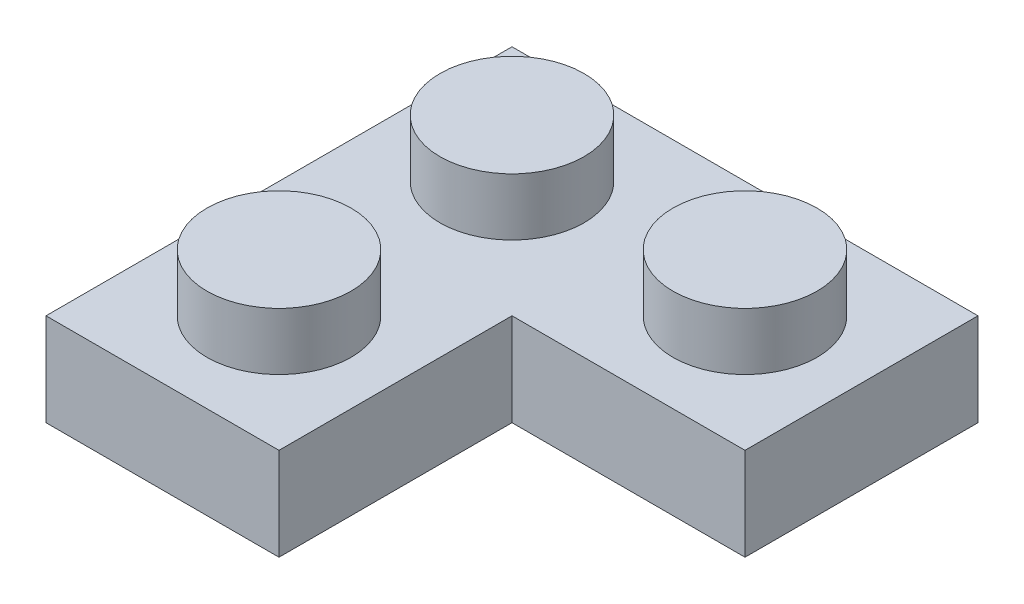
ISO-10303-21;
HEADER;
FILE_DESCRIPTION(('STEP AP214'),'2;1');
FILE_NAME('part.step','',(''),(''),'','','');
FILE_SCHEMA(('AUTOMOTIVE_DESIGN { 1 0 10303 214 1 1 1 1 }'));
ENDSEC;
DATA;
#1=APPLICATION_CONTEXT('core data for automotive mechanical design processes');
#2=APPLICATION_PROTOCOL_DEFINITION('international standard','automotive_design',2000,#1);
#3=PRODUCT_CONTEXT('',#1,'mechanical');
#4=PRODUCT('Part','Part','',(#3));
#5=PRODUCT_RELATED_PRODUCT_CATEGORY('part','',(#4));
#6=PRODUCT_DEFINITION_FORMATION('','',#4);
#7=PRODUCT_DEFINITION_CONTEXT('part definition',#1,'design');
#8=PRODUCT_DEFINITION('design','',#6,#7);
#9=PRODUCT_DEFINITION_SHAPE('','',#8);
#10=(LENGTH_UNIT() NAMED_UNIT(*) SI_UNIT(.MILLI.,.METRE.));
#11=(NAMED_UNIT(*) PLANE_ANGLE_UNIT() SI_UNIT($,.RADIAN.));
#12=(NAMED_UNIT(*) SI_UNIT($,.STERADIAN.) SOLID_ANGLE_UNIT());
#13=UNCERTAINTY_MEASURE_WITH_UNIT(LENGTH_MEASURE(1.E-05),#10,'distance_accuracy_value','');
#14=(GEOMETRIC_REPRESENTATION_CONTEXT(3) GLOBAL_UNCERTAINTY_ASSIGNED_CONTEXT((#13)) GLOBAL_UNIT_ASSIGNED_CONTEXT((#10,
#11,#12)) REPRESENTATION_CONTEXT('',''));
#15=CARTESIAN_POINT('',(0.,0.,0.));
#16=DIRECTION('',(0.,0.,1.));
#17=DIRECTION('',(1.,0.,0.));
#18=AXIS2_PLACEMENT_3D('',#15,#16,#17);
#19=CARTESIAN_POINT('',(7.925,-3.15,0.));
#20=DIRECTION('',(0.,0.,1.));
#21=DIRECTION('',(1.,0.,0.));
#22=AXIS2_PLACEMENT_3D('',#19,#20,#21);
#23=PLANE('',#22);
#24=DIRECTION('',(1.,0.,0.));
#25=VECTOR('',#24,1.);
#26=CARTESIAN_POINT('',(7.925,0.,0.));
#27=LINE('',#26,#25);
#28=CARTESIAN_POINT('',(0.,0.,0.));
#29=VERTEX_POINT('',#28);
#30=CARTESIAN_POINT('',(7.925,0.,0.));
#31=VERTEX_POINT('',#30);
#32=EDGE_CURVE('E131',#29,#31,#27,.T.);
#33=ORIENTED_EDGE('',*,*,#32,.F.);
#34=DIRECTION('',(0.,1.,0.));
#35=VECTOR('',#34,1.);
#36=CARTESIAN_POINT('',(0.,-3.15,0.));
#37=LINE('',#36,#35);
#38=CARTESIAN_POINT('',(0.,-3.15,0.));
#39=VERTEX_POINT('',#38);
#40=EDGE_CURVE('E11',#39,#29,#37,.T.);
#41=ORIENTED_EDGE('',*,*,#40,.F.);
#42=DIRECTION('',(1.,0.,0.));
#43=VECTOR('',#42,1.);
#44=CARTESIAN_POINT('',(7.925,-3.15,0.));
#45=LINE('',#44,#43);
#46=CARTESIAN_POINT('',(7.925,-3.15,0.));
#47=VERTEX_POINT('',#46);
#48=EDGE_CURVE('E146',#39,#47,#45,.T.);
#49=ORIENTED_EDGE('',*,*,#48,.T.);
#50=DIRECTION('',(0.,1.,0.));
#51=VECTOR('',#50,1.);
#52=CARTESIAN_POINT('',(7.925,-3.15,0.));
#53=LINE('',#52,#51);
#54=EDGE_CURVE('E36',#47,#31,#53,.T.);
#55=ORIENTED_EDGE('',*,*,#54,.T.);
#56=EDGE_LOOP('',(#33,#41,#49,#55));
#57=FACE_BOUND('',#56,.T.);
#58=ADVANCED_FACE('F33',(#57),#23,.T.);
#59=CARTESIAN_POINT('',(0.,-3.15,0.));
#60=DIRECTION('',(1.,0.,0.));
#61=DIRECTION('',(0.,0.,-1.));
#62=AXIS2_PLACEMENT_3D('',#59,#60,#61);
#63=PLANE('',#62);
#64=DIRECTION('',(0.,0.,-1.));
#65=VECTOR('',#64,1.);
#66=CARTESIAN_POINT('',(0.,0.,0.));
#67=LINE('',#66,#65);
#68=CARTESIAN_POINT('',(0.,0.,7.925));
#69=VERTEX_POINT('',#68);
#70=EDGE_CURVE('E144',#69,#29,#67,.T.);
#71=ORIENTED_EDGE('',*,*,#70,.F.);
#72=DIRECTION('',(0.,1.,0.));
#73=VECTOR('',#72,1.);
#74=CARTESIAN_POINT('',(0.,-3.15,7.925));
#75=LINE('',#74,#73);
#76=CARTESIAN_POINT('',(0.,-3.15,7.925));
#77=VERTEX_POINT('',#76);
#78=EDGE_CURVE('E41',#77,#69,#75,.T.);
#79=ORIENTED_EDGE('',*,*,#78,.F.);
#80=DIRECTION('',(0.,0.,-1.));
#81=VECTOR('',#80,1.);
#82=CARTESIAN_POINT('',(0.,-3.15,0.));
#83=LINE('',#82,#81);
#84=EDGE_CURVE('E121',#77,#39,#83,.T.);
#85=ORIENTED_EDGE('',*,*,#84,.T.);
#86=ORIENTED_EDGE('',*,*,#40,.T.);
#87=EDGE_LOOP('',(#71,#79,#85,#86));
#88=FACE_BOUND('',#87,.T.);
#89=ADVANCED_FACE('F154',(#88),#63,.T.);
#90=CARTESIAN_POINT('',(0.,-3.15,7.925));
#91=DIRECTION('',(0.,0.,1.));
#92=DIRECTION('',(1.,0.,0.));
#93=AXIS2_PLACEMENT_3D('',#90,#91,#92);
#94=PLANE('',#93);
#95=DIRECTION('',(1.,0.,0.));
#96=VECTOR('',#95,1.);
#97=CARTESIAN_POINT('',(0.,0.,7.925));
#98=LINE('',#97,#96);
#99=CARTESIAN_POINT('',(-7.925,0.,7.925));
#100=VERTEX_POINT('',#99);
#101=EDGE_CURVE('E108',#100,#69,#98,.T.);
#102=ORIENTED_EDGE('',*,*,#101,.F.);
#103=DIRECTION('',(0.,1.,0.));
#104=VECTOR('',#103,1.);
#105=CARTESIAN_POINT('',(-7.925,-3.15,7.925));
#106=LINE('',#105,#104);
#107=CARTESIAN_POINT('',(-7.925,-3.15,7.925));
#108=VERTEX_POINT('',#107);
#109=EDGE_CURVE('E102',#108,#100,#106,.T.);
#110=ORIENTED_EDGE('',*,*,#109,.F.);
#111=DIRECTION('',(1.,0.,0.));
#112=VECTOR('',#111,1.);
#113=CARTESIAN_POINT('',(0.,-3.15,7.925));
#114=LINE('',#113,#112);
#115=EDGE_CURVE('E105',#108,#77,#114,.T.);
#116=ORIENTED_EDGE('',*,*,#115,.T.);
#117=ORIENTED_EDGE('',*,*,#78,.T.);
#118=EDGE_LOOP('',(#102,#110,#116,#117));
#119=FACE_BOUND('',#118,.T.);
#120=ADVANCED_FACE('F104',(#119),#94,.T.);
#121=CARTESIAN_POINT('',(-7.925,-3.15,7.925));
#122=DIRECTION('',(-1.,0.,0.));
#123=DIRECTION('',(0.,0.,1.));
#124=AXIS2_PLACEMENT_3D('',#121,#122,#123);
#125=PLANE('',#124);
#126=DIRECTION('',(0.,0.,1.));
#127=VECTOR('',#126,1.);
#128=CARTESIAN_POINT('',(-7.925,0.,7.925));
#129=LINE('',#128,#127);
#130=CARTESIAN_POINT('',(-7.925,0.,-7.925));
#131=VERTEX_POINT('',#130);
#132=EDGE_CURVE('E141',#131,#100,#129,.T.);
#133=ORIENTED_EDGE('',*,*,#132,.F.);
#134=DIRECTION('',(0.,1.,0.));
#135=VECTOR('',#134,1.);
#136=CARTESIAN_POINT('',(-7.925,-3.15,-7.925));
#137=LINE('',#136,#135);
#138=CARTESIAN_POINT('',(-7.925,-3.15,-7.925));
#139=VERTEX_POINT('',#138);
#140=EDGE_CURVE('E113',#139,#131,#137,.T.);
#141=ORIENTED_EDGE('',*,*,#140,.F.);
#142=DIRECTION('',(0.,0.,1.));
#143=VECTOR('',#142,1.);
#144=CARTESIAN_POINT('',(-7.925,-3.15,7.925));
#145=LINE('',#144,#143);
#146=EDGE_CURVE('E119',#139,#108,#145,.T.);
#147=ORIENTED_EDGE('',*,*,#146,.T.);
#148=ORIENTED_EDGE('',*,*,#109,.T.);
#149=EDGE_LOOP('',(#133,#141,#147,#148));
#150=FACE_BOUND('',#149,.T.);
#151=ADVANCED_FACE('F123',(#150),#125,.T.);
#152=CARTESIAN_POINT('',(-7.925,-3.15,-7.925));
#153=DIRECTION('',(0.,0.,-1.));
#154=DIRECTION('',(-1.,0.,0.));
#155=AXIS2_PLACEMENT_3D('',#152,#153,#154);
#156=PLANE('',#155);
#157=DIRECTION('',(-1.,0.,0.));
#158=VECTOR('',#157,1.);
#159=CARTESIAN_POINT('',(-7.925,0.,-7.925));
#160=LINE('',#159,#158);
#161=CARTESIAN_POINT('',(7.925,0.,-7.925));
#162=VERTEX_POINT('',#161);
#163=EDGE_CURVE('E138',#162,#131,#160,.T.);
#164=ORIENTED_EDGE('',*,*,#163,.F.);
#165=DIRECTION('',(0.,1.,0.));
#166=VECTOR('',#165,1.);
#167=CARTESIAN_POINT('',(7.925,-3.15,-7.925));
#168=LINE('',#167,#166);
#169=CARTESIAN_POINT('',(7.925,-3.15,-7.925));
#170=VERTEX_POINT('',#169);
#171=EDGE_CURVE('E149',#170,#162,#168,.T.);
#172=ORIENTED_EDGE('',*,*,#171,.F.);
#173=DIRECTION('',(-1.,0.,0.));
#174=VECTOR('',#173,1.);
#175=CARTESIAN_POINT('',(-7.925,-3.15,-7.925));
#176=LINE('',#175,#174);
#177=EDGE_CURVE('E124',#170,#139,#176,.T.);
#178=ORIENTED_EDGE('',*,*,#177,.T.);
#179=ORIENTED_EDGE('',*,*,#140,.T.);
#180=EDGE_LOOP('',(#164,#172,#178,#179));
#181=FACE_BOUND('',#180,.T.);
#182=ADVANCED_FACE('F167',(#181),#156,.T.);
#183=CARTESIAN_POINT('',(7.925,-3.15,-7.925));
#184=DIRECTION('',(1.,0.,0.));
#185=DIRECTION('',(0.,0.,-1.));
#186=AXIS2_PLACEMENT_3D('',#183,#184,#185);
#187=PLANE('',#186);
#188=DIRECTION('',(0.,0.,-1.));
#189=VECTOR('',#188,1.);
#190=CARTESIAN_POINT('',(7.925,0.,-7.925));
#191=LINE('',#190,#189);
#192=EDGE_CURVE('E134',#31,#162,#191,.T.);
#193=ORIENTED_EDGE('',*,*,#192,.F.);
#194=ORIENTED_EDGE('',*,*,#54,.F.);
#195=DIRECTION('',(0.,0.,-1.));
#196=VECTOR('',#195,1.);
#197=CARTESIAN_POINT('',(7.925,-3.15,-7.925));
#198=LINE('',#197,#196);
#199=EDGE_CURVE('E126',#47,#170,#198,.T.);
#200=ORIENTED_EDGE('',*,*,#199,.T.);
#201=ORIENTED_EDGE('',*,*,#171,.T.);
#202=EDGE_LOOP('',(#193,#194,#200,#201));
#203=FACE_BOUND('',#202,.T.);
#204=ADVANCED_FACE('F151',(#203),#187,.T.);
#205=CARTESIAN_POINT('',(0.,-3.15,0.));
#206=DIRECTION('',(0.,1.,0.));
#207=DIRECTION('',(0.,0.,1.));
#208=AXIS2_PLACEMENT_3D('',#205,#206,#207);
#209=PLANE('',#208);
#210=DIRECTION('',(0.,0.,-1.));
#211=VECTOR('',#210,1.);
#212=CARTESIAN_POINT('',(-1.5,-3.15,0.));
#213=LINE('',#212,#211);
#214=CARTESIAN_POINT('',(-1.5,-3.15,6.425));
#215=VERTEX_POINT('',#214);
#216=CARTESIAN_POINT('',(-1.5,-3.15,-1.5));
#217=VERTEX_POINT('',#216);
#218=EDGE_CURVE('E291',#215,#217,#213,.T.);
#219=ORIENTED_EDGE('',*,*,#218,.T.);
#220=DIRECTION('',(1.,0.,0.));
#221=VECTOR('',#220,1.);
#222=CARTESIAN_POINT('',(0.,-3.15,-1.5));
#223=LINE('',#222,#221);
#224=CARTESIAN_POINT('',(6.425,-3.15,-1.5));
#225=VERTEX_POINT('',#224);
#226=EDGE_CURVE('E294',#217,#225,#223,.T.);
#227=ORIENTED_EDGE('',*,*,#226,.T.);
#228=DIRECTION('',(0.,0.,-1.));
#229=VECTOR('',#228,1.);
#230=CARTESIAN_POINT('',(6.425,-3.15,0.));
#231=LINE('',#230,#229);
#232=CARTESIAN_POINT('',(6.425,-3.15,-6.425));
#233=VERTEX_POINT('',#232);
#234=EDGE_CURVE('E328',#225,#233,#231,.T.);
#235=ORIENTED_EDGE('',*,*,#234,.T.);
#236=DIRECTION('',(-1.,0.,0.));
#237=VECTOR('',#236,1.);
#238=CARTESIAN_POINT('',(0.,-3.15,-6.425));
#239=LINE('',#238,#237);
#240=CARTESIAN_POINT('',(-6.425,-3.15,-6.425));
#241=VERTEX_POINT('',#240);
#242=EDGE_CURVE('E49',#233,#241,#239,.T.);
#243=ORIENTED_EDGE('',*,*,#242,.T.);
#244=DIRECTION('',(0.,0.,1.));
#245=VECTOR('',#244,1.);
#246=CARTESIAN_POINT('',(-6.425,-3.15,0.));
#247=LINE('',#246,#245);
#248=CARTESIAN_POINT('',(-6.425,-3.15,6.425));
#249=VERTEX_POINT('',#248);
#250=EDGE_CURVE('E333',#241,#249,#247,.T.);
#251=ORIENTED_EDGE('',*,*,#250,.T.);
#252=DIRECTION('',(1.,0.,0.));
#253=VECTOR('',#252,1.);
#254=CARTESIAN_POINT('',(0.,-3.15,6.425));
#255=LINE('',#254,#253);
#256=EDGE_CURVE('E330',#249,#215,#255,.T.);
#257=ORIENTED_EDGE('',*,*,#256,.T.);
#258=EDGE_LOOP('',(#219,#227,#235,#243,#251,#257));
#259=FACE_BOUND('',#258,.T.);
#260=ORIENTED_EDGE('',*,*,#48,.F.);
#261=ORIENTED_EDGE('',*,*,#84,.F.);
#262=ORIENTED_EDGE('',*,*,#115,.F.);
#263=ORIENTED_EDGE('',*,*,#146,.F.);
#264=ORIENTED_EDGE('',*,*,#177,.F.);
#265=ORIENTED_EDGE('',*,*,#199,.F.);
#266=EDGE_LOOP('',(#260,#261,#262,#263,#264,#265));
#267=FACE_BOUND('',#266,.T.);
#268=ADVANCED_FACE('F117',(#259,#267),#209,.F.);
#269=CARTESIAN_POINT('',(0.,0.,0.));
#270=DIRECTION('',(0.,1.,0.));
#271=DIRECTION('',(0.,0.,1.));
#272=AXIS2_PLACEMENT_3D('',#269,#270,#271);
#273=PLANE('',#272);
#274=CARTESIAN_POINT('',(-3.9625,0.,3.9625));
#275=DIRECTION('',(0.,1.,0.));
#276=DIRECTION('',(0.,0.,1.));
#277=AXIS2_PLACEMENT_3D('',#274,#275,#276);
#278=CIRCLE('',#277,2.45);
#279=CARTESIAN_POINT('',(-3.9625,0.,6.4125));
#280=VERTEX_POINT('',#279);
#281=EDGE_CURVE('E287',#280,#280,#278,.T.);
#282=ORIENTED_EDGE('',*,*,#281,.F.);
#283=EDGE_LOOP('',(#282));
#284=FACE_BOUND('',#283,.T.);
#285=CARTESIAN_POINT('',(3.9625,0.,-3.9625));
#286=DIRECTION('',(0.,1.,0.));
#287=DIRECTION('',(0.,0.,1.));
#288=AXIS2_PLACEMENT_3D('',#285,#286,#287);
#289=CIRCLE('',#288,2.45);
#290=CARTESIAN_POINT('',(3.9625,0.,-1.5125));
#291=VERTEX_POINT('',#290);
#292=EDGE_CURVE('E342',#291,#291,#289,.T.);
#293=ORIENTED_EDGE('',*,*,#292,.F.);
#294=EDGE_LOOP('',(#293));
#295=FACE_BOUND('',#294,.T.);
#296=CARTESIAN_POINT('',(-3.9625,0.,-3.9625));
#297=DIRECTION('',(0.,1.,0.));
#298=DIRECTION('',(0.,0.,1.));
#299=AXIS2_PLACEMENT_3D('',#296,#297,#298);
#300=CIRCLE('',#299,2.45);
#301=CARTESIAN_POINT('',(-3.9625,0.,-1.5125));
#302=VERTEX_POINT('',#301);
#303=EDGE_CURVE('E348',#302,#302,#300,.T.);
#304=ORIENTED_EDGE('',*,*,#303,.F.);
#305=EDGE_LOOP('',(#304));
#306=FACE_BOUND('',#305,.T.);
#307=ORIENTED_EDGE('',*,*,#32,.T.);
#308=ORIENTED_EDGE('',*,*,#192,.T.);
#309=ORIENTED_EDGE('',*,*,#163,.T.);
#310=ORIENTED_EDGE('',*,*,#132,.T.);
#311=ORIENTED_EDGE('',*,*,#101,.T.);
#312=ORIENTED_EDGE('',*,*,#70,.T.);
#313=EDGE_LOOP('',(#307,#308,#309,#310,#311,#312));
#314=FACE_BOUND('',#313,.T.);
#315=ADVANCED_FACE('F153',(#284,#295,#306,#314),#273,.T.);
#316=CARTESIAN_POINT('',(-3.9625,1.95,-3.9625));
#317=DIRECTION('',(0.,-1.,0.));
#318=DIRECTION('',(0.,0.,-1.));
#319=AXIS2_PLACEMENT_3D('',#316,#317,#318);
#320=CYLINDRICAL_SURFACE('',#319,2.45);
#321=CARTESIAN_POINT('',(-3.9625,1.95,-3.9625));
#322=DIRECTION('',(0.,1.,0.));
#323=DIRECTION('',(0.,0.,1.));
#324=AXIS2_PLACEMENT_3D('',#321,#322,#323);
#325=CIRCLE('',#324,2.45);
#326=CARTESIAN_POINT('',(-3.9625,1.95,-1.5125));
#327=VERTEX_POINT('',#326);
#328=EDGE_CURVE('E135',#327,#327,#325,.T.);
#329=ORIENTED_EDGE('',*,*,#328,.F.);
#330=EDGE_LOOP('',(#329));
#331=FACE_BOUND('',#330,.T.);
#332=ORIENTED_EDGE('',*,*,#303,.T.);
#333=EDGE_LOOP('',(#332));
#334=FACE_BOUND('',#333,.T.);
#335=ADVANCED_FACE('F178',(#331,#334),#320,.T.);
#336=CARTESIAN_POINT('',(-3.9625,1.95,-3.9625));
#337=DIRECTION('',(0.,1.,0.));
#338=DIRECTION('',(0.,0.,1.));
#339=AXIS2_PLACEMENT_3D('',#336,#337,#338);
#340=PLANE('',#339);
#341=ORIENTED_EDGE('',*,*,#328,.T.);
#342=EDGE_LOOP('',(#341));
#343=FACE_BOUND('',#342,.T.);
#344=ADVANCED_FACE('F184',(#343),#340,.T.);
#345=CARTESIAN_POINT('',(3.9625,1.95,-3.9625));
#346=DIRECTION('',(0.,-1.,0.));
#347=DIRECTION('',(0.,0.,-1.));
#348=AXIS2_PLACEMENT_3D('',#345,#346,#347);
#349=CYLINDRICAL_SURFACE('',#348,2.45);
#350=CARTESIAN_POINT('',(3.9625,1.95,-3.9625));
#351=DIRECTION('',(0.,1.,0.));
#352=DIRECTION('',(0.,0.,1.));
#353=AXIS2_PLACEMENT_3D('',#350,#351,#352);
#354=CIRCLE('',#353,2.45);
#355=CARTESIAN_POINT('',(3.9625,1.95,-1.5125));
#356=VERTEX_POINT('',#355);
#357=EDGE_CURVE('E345',#356,#356,#354,.T.);
#358=ORIENTED_EDGE('',*,*,#357,.F.);
#359=EDGE_LOOP('',(#358));
#360=FACE_BOUND('',#359,.T.);
#361=ORIENTED_EDGE('',*,*,#292,.T.);
#362=EDGE_LOOP('',(#361));
#363=FACE_BOUND('',#362,.T.);
#364=ADVANCED_FACE('F188',(#360,#363),#349,.T.);
#365=CARTESIAN_POINT('',(3.9625,1.95,-3.9625));
#366=DIRECTION('',(0.,1.,0.));
#367=DIRECTION('',(0.,0.,1.));
#368=AXIS2_PLACEMENT_3D('',#365,#366,#367);
#369=PLANE('',#368);
#370=ORIENTED_EDGE('',*,*,#357,.T.);
#371=EDGE_LOOP('',(#370));
#372=FACE_BOUND('',#371,.T.);
#373=ADVANCED_FACE('F192',(#372),#369,.T.);
#374=CARTESIAN_POINT('',(-3.9625,1.95,3.9625));
#375=DIRECTION('',(0.,-1.,0.));
#376=DIRECTION('',(0.,0.,-1.));
#377=AXIS2_PLACEMENT_3D('',#374,#375,#376);
#378=CYLINDRICAL_SURFACE('',#377,2.45);
#379=CARTESIAN_POINT('',(-3.9625,1.95,3.9625));
#380=DIRECTION('',(0.,1.,0.));
#381=DIRECTION('',(0.,0.,1.));
#382=AXIS2_PLACEMENT_3D('',#379,#380,#381);
#383=CIRCLE('',#382,2.45);
#384=CARTESIAN_POINT('',(-3.9625,1.95,6.4125));
#385=VERTEX_POINT('',#384);
#386=EDGE_CURVE('E339',#385,#385,#383,.T.);
#387=ORIENTED_EDGE('',*,*,#386,.F.);
#388=EDGE_LOOP('',(#387));
#389=FACE_BOUND('',#388,.T.);
#390=ORIENTED_EDGE('',*,*,#281,.T.);
#391=EDGE_LOOP('',(#390));
#392=FACE_BOUND('',#391,.T.);
#393=ADVANCED_FACE('F196',(#389,#392),#378,.T.);
#394=CARTESIAN_POINT('',(-3.9625,1.95,3.9625));
#395=DIRECTION('',(0.,1.,0.));
#396=DIRECTION('',(0.,0.,1.));
#397=AXIS2_PLACEMENT_3D('',#394,#395,#396);
#398=PLANE('',#397);
#399=ORIENTED_EDGE('',*,*,#386,.T.);
#400=EDGE_LOOP('',(#399));
#401=FACE_BOUND('',#400,.T.);
#402=ADVANCED_FACE('F200',(#401),#398,.T.);
#403=CARTESIAN_POINT('',(7.925,-3.15,-1.5));
#404=DIRECTION('',(0.,0.,1.));
#405=DIRECTION('',(1.,0.,0.));
#406=AXIS2_PLACEMENT_3D('',#403,#404,#405);
#407=PLANE('',#406);
#408=DIRECTION('',(1.,0.,0.));
#409=VECTOR('',#408,1.);
#410=CARTESIAN_POINT('',(0.,-1.5,-1.5));
#411=LINE('',#410,#409);
#412=CARTESIAN_POINT('',(-1.5,-1.5,-1.5));
#413=VERTEX_POINT('',#412);
#414=CARTESIAN_POINT('',(6.425,-1.5,-1.5));
#415=VERTEX_POINT('',#414);
#416=EDGE_CURVE('E262',#413,#415,#411,.T.);
#417=ORIENTED_EDGE('',*,*,#416,.T.);
#418=DIRECTION('',(0.,1.,0.));
#419=VECTOR('',#418,1.);
#420=CARTESIAN_POINT('',(6.425,-3.15,-1.5));
#421=LINE('',#420,#419);
#422=EDGE_CURVE('E265',#225,#415,#421,.T.);
#423=ORIENTED_EDGE('',*,*,#422,.F.);
#424=ORIENTED_EDGE('',*,*,#226,.F.);
#425=DIRECTION('',(0.,1.,0.));
#426=VECTOR('',#425,1.);
#427=CARTESIAN_POINT('',(-1.5,-3.15,-1.5));
#428=LINE('',#427,#426);
#429=EDGE_CURVE('E269',#217,#413,#428,.T.);
#430=ORIENTED_EDGE('',*,*,#429,.T.);
#431=EDGE_LOOP('',(#417,#423,#424,#430));
#432=FACE_BOUND('',#431,.T.);
#433=ADVANCED_FACE('F204',(#432),#407,.F.);
#434=CARTESIAN_POINT('',(-1.5,-3.15,0.));
#435=DIRECTION('',(1.,0.,0.));
#436=DIRECTION('',(0.,0.,-1.));
#437=AXIS2_PLACEMENT_3D('',#434,#435,#436);
#438=PLANE('',#437);
#439=DIRECTION('',(0.,0.,-1.));
#440=VECTOR('',#439,1.);
#441=CARTESIAN_POINT('',(-1.5,-1.5,0.));
#442=LINE('',#441,#440);
#443=CARTESIAN_POINT('',(-1.5,-1.5,6.425));
#444=VERTEX_POINT('',#443);
#445=EDGE_CURVE('E292',#444,#413,#442,.T.);
#446=ORIENTED_EDGE('',*,*,#445,.T.);
#447=ORIENTED_EDGE('',*,*,#429,.F.);
#448=ORIENTED_EDGE('',*,*,#218,.F.);
#449=DIRECTION('',(0.,1.,0.));
#450=VECTOR('',#449,1.);
#451=CARTESIAN_POINT('',(-1.5,-3.15,6.425));
#452=LINE('',#451,#450);
#453=EDGE_CURVE('E288',#215,#444,#452,.T.);
#454=ORIENTED_EDGE('',*,*,#453,.T.);
#455=EDGE_LOOP('',(#446,#447,#448,#454));
#456=FACE_BOUND('',#455,.T.);
#457=ADVANCED_FACE('F248',(#456),#438,.F.);
#458=CARTESIAN_POINT('',(0.,-3.15,6.425));
#459=DIRECTION('',(0.,0.,1.));
#460=DIRECTION('',(1.,0.,0.));
#461=AXIS2_PLACEMENT_3D('',#458,#459,#460);
#462=PLANE('',#461);
#463=DIRECTION('',(1.,0.,0.));
#464=VECTOR('',#463,1.);
#465=CARTESIAN_POINT('',(0.,-1.5,6.425));
#466=LINE('',#465,#464);
#467=CARTESIAN_POINT('',(-6.425,-1.5,6.425));
#468=VERTEX_POINT('',#467);
#469=EDGE_CURVE('E295',#468,#444,#466,.T.);
#470=ORIENTED_EDGE('',*,*,#469,.T.);
#471=ORIENTED_EDGE('',*,*,#453,.F.);
#472=ORIENTED_EDGE('',*,*,#256,.F.);
#473=DIRECTION('',(0.,1.,0.));
#474=VECTOR('',#473,1.);
#475=CARTESIAN_POINT('',(-6.425,-3.15,6.425));
#476=LINE('',#475,#474);
#477=EDGE_CURVE('E298',#249,#468,#476,.T.);
#478=ORIENTED_EDGE('',*,*,#477,.T.);
#479=EDGE_LOOP('',(#470,#471,#472,#478));
#480=FACE_BOUND('',#479,.T.);
#481=ADVANCED_FACE('F244',(#480),#462,.F.);
#482=CARTESIAN_POINT('',(-6.425,-3.15,7.925));
#483=DIRECTION('',(-1.,0.,0.));
#484=DIRECTION('',(0.,0.,1.));
#485=AXIS2_PLACEMENT_3D('',#482,#483,#484);
#486=PLANE('',#485);
#487=DIRECTION('',(0.,0.,1.));
#488=VECTOR('',#487,1.);
#489=CARTESIAN_POINT('',(-6.425,-1.5,0.));
#490=LINE('',#489,#488);
#491=CARTESIAN_POINT('',(-6.425,-1.5,-6.425));
#492=VERTEX_POINT('',#491);
#493=EDGE_CURVE('E301',#492,#468,#490,.T.);
#494=ORIENTED_EDGE('',*,*,#493,.T.);
#495=ORIENTED_EDGE('',*,*,#477,.F.);
#496=ORIENTED_EDGE('',*,*,#250,.F.);
#497=DIRECTION('',(0.,1.,0.));
#498=VECTOR('',#497,1.);
#499=CARTESIAN_POINT('',(-6.425,-3.15,-6.425));
#500=LINE('',#499,#498);
#501=EDGE_CURVE('E304',#241,#492,#500,.T.);
#502=ORIENTED_EDGE('',*,*,#501,.T.);
#503=EDGE_LOOP('',(#494,#495,#496,#502));
#504=FACE_BOUND('',#503,.T.);
#505=ADVANCED_FACE('F241',(#504),#486,.F.);
#506=CARTESIAN_POINT('',(-7.925,-3.15,-6.425));
#507=DIRECTION('',(0.,0.,-1.));
#508=DIRECTION('',(-1.,0.,0.));
#509=AXIS2_PLACEMENT_3D('',#506,#507,#508);
#510=PLANE('',#509);
#511=DIRECTION('',(-1.,0.,0.));
#512=VECTOR('',#511,1.);
#513=CARTESIAN_POINT('',(0.,-1.5,-6.425));
#514=LINE('',#513,#512);
#515=CARTESIAN_POINT('',(6.425,-1.5,-6.425));
#516=VERTEX_POINT('',#515);
#517=EDGE_CURVE('E280',#516,#492,#514,.T.);
#518=ORIENTED_EDGE('',*,*,#517,.T.);
#519=ORIENTED_EDGE('',*,*,#501,.F.);
#520=ORIENTED_EDGE('',*,*,#242,.F.);
#521=DIRECTION('',(0.,1.,0.));
#522=VECTOR('',#521,1.);
#523=CARTESIAN_POINT('',(6.425,-3.15,-6.425));
#524=LINE('',#523,#522);
#525=EDGE_CURVE('E290',#233,#516,#524,.T.);
#526=ORIENTED_EDGE('',*,*,#525,.T.);
#527=EDGE_LOOP('',(#518,#519,#520,#526));
#528=FACE_BOUND('',#527,.T.);
#529=ADVANCED_FACE('F237',(#528),#510,.F.);
#530=CARTESIAN_POINT('',(6.425,-3.15,-7.925));
#531=DIRECTION('',(1.,0.,0.));
#532=DIRECTION('',(0.,0.,-1.));
#533=AXIS2_PLACEMENT_3D('',#530,#531,#532);
#534=PLANE('',#533);
#535=DIRECTION('',(0.,0.,-1.));
#536=VECTOR('',#535,1.);
#537=CARTESIAN_POINT('',(6.425,-1.5,0.));
#538=LINE('',#537,#536);
#539=EDGE_CURVE('E276',#415,#516,#538,.T.);
#540=ORIENTED_EDGE('',*,*,#539,.T.);
#541=ORIENTED_EDGE('',*,*,#525,.F.);
#542=ORIENTED_EDGE('',*,*,#234,.F.);
#543=ORIENTED_EDGE('',*,*,#422,.T.);
#544=EDGE_LOOP('',(#540,#541,#542,#543));
#545=FACE_BOUND('',#544,.T.);
#546=ADVANCED_FACE('F233',(#545),#534,.F.);
#547=CARTESIAN_POINT('',(0.,-1.5,0.));
#548=DIRECTION('',(0.,1.,0.));
#549=DIRECTION('',(0.,0.,1.));
#550=AXIS2_PLACEMENT_3D('',#547,#548,#549);
#551=PLANE('',#550);
#552=CARTESIAN_POINT('',(-3.9625,-1.5,3.9625));
#553=DIRECTION('',(0.,1.,0.));
#554=DIRECTION('',(0.,0.,1.));
#555=AXIS2_PLACEMENT_3D('',#552,#553,#554);
#556=CIRCLE('',#555,0.950000000000001);
#557=CARTESIAN_POINT('',(-3.9625,-1.5,4.9125));
#558=VERTEX_POINT('',#557);
#559=EDGE_CURVE('E312',#558,#558,#556,.T.);
#560=ORIENTED_EDGE('',*,*,#559,.T.);
#561=EDGE_LOOP('',(#560));
#562=FACE_BOUND('',#561,.T.);
#563=CARTESIAN_POINT('',(3.9625,-1.5,-3.9625));
#564=DIRECTION('',(0.,1.,0.));
#565=DIRECTION('',(0.,0.,1.));
#566=AXIS2_PLACEMENT_3D('',#563,#564,#565);
#567=CIRCLE('',#566,0.950000000000003);
#568=CARTESIAN_POINT('',(3.9625,-1.5,-3.0125));
#569=VERTEX_POINT('',#568);
#570=EDGE_CURVE('E316',#569,#569,#567,.T.);
#571=ORIENTED_EDGE('',*,*,#570,.T.);
#572=EDGE_LOOP('',(#571));
#573=FACE_BOUND('',#572,.T.);
#574=CARTESIAN_POINT('',(-3.9625,-1.5,-3.9625));
#575=DIRECTION('',(0.,1.,0.));
#576=DIRECTION('',(0.,0.,1.));
#577=AXIS2_PLACEMENT_3D('',#574,#575,#576);
#578=CIRCLE('',#577,0.950000000000002);
#579=CARTESIAN_POINT('',(-3.9625,-1.5,-3.0125));
#580=VERTEX_POINT('',#579);
#581=EDGE_CURVE('E283',#580,#580,#578,.T.);
#582=ORIENTED_EDGE('',*,*,#581,.T.);
#583=EDGE_LOOP('',(#582));
#584=FACE_BOUND('',#583,.T.);
#585=ORIENTED_EDGE('',*,*,#416,.F.);
#586=ORIENTED_EDGE('',*,*,#445,.F.);
#587=ORIENTED_EDGE('',*,*,#469,.F.);
#588=ORIENTED_EDGE('',*,*,#493,.F.);
#589=ORIENTED_EDGE('',*,*,#517,.F.);
#590=ORIENTED_EDGE('',*,*,#539,.F.);
#591=EDGE_LOOP('',(#585,#586,#587,#588,#589,#590));
#592=FACE_BOUND('',#591,.T.);
#593=ADVANCED_FACE('F229',(#562,#573,#584,#592),#551,.F.);
#594=CARTESIAN_POINT('',(-3.9625,1.95,-3.9625));
#595=DIRECTION('',(0.,-1.,0.));
#596=DIRECTION('',(0.,0.,-1.));
#597=AXIS2_PLACEMENT_3D('',#594,#595,#596);
#598=CYLINDRICAL_SURFACE('',#597,0.950000000000002);
#599=CARTESIAN_POINT('',(-3.9625,0.45,-3.9625));
#600=DIRECTION('',(0.,1.,0.));
#601=DIRECTION('',(0.,0.,1.));
#602=AXIS2_PLACEMENT_3D('',#599,#600,#601);
#603=CIRCLE('',#602,0.950000000000002);
#604=CARTESIAN_POINT('',(-3.9625,0.45,-3.0125));
#605=VERTEX_POINT('',#604);
#606=EDGE_CURVE('E277',#605,#605,#603,.T.);
#607=ORIENTED_EDGE('',*,*,#606,.T.);
#608=EDGE_LOOP('',(#607));
#609=FACE_BOUND('',#608,.T.);
#610=ORIENTED_EDGE('',*,*,#581,.F.);
#611=EDGE_LOOP('',(#610));
#612=FACE_BOUND('',#611,.T.);
#613=ADVANCED_FACE('F225',(#609,#612),#598,.F.);
#614=CARTESIAN_POINT('',(-3.9625,0.45,-3.9625));
#615=DIRECTION('',(0.,1.,0.));
#616=DIRECTION('',(0.,0.,1.));
#617=AXIS2_PLACEMENT_3D('',#614,#615,#616);
#618=PLANE('',#617);
#619=ORIENTED_EDGE('',*,*,#606,.F.);
#620=EDGE_LOOP('',(#619));
#621=FACE_BOUND('',#620,.T.);
#622=ADVANCED_FACE('F221',(#621),#618,.F.);
#623=CARTESIAN_POINT('',(3.9625,1.95,-3.9625));
#624=DIRECTION('',(0.,-1.,0.));
#625=DIRECTION('',(0.,0.,-1.));
#626=AXIS2_PLACEMENT_3D('',#623,#624,#625);
#627=CYLINDRICAL_SURFACE('',#626,0.950000000000003);
#628=CARTESIAN_POINT('',(3.9625,0.45,-3.9625));
#629=DIRECTION('',(0.,1.,0.));
#630=DIRECTION('',(0.,0.,1.));
#631=AXIS2_PLACEMENT_3D('',#628,#629,#630);
#632=CIRCLE('',#631,0.950000000000003);
#633=CARTESIAN_POINT('',(3.9625,0.45,-3.0125));
#634=VERTEX_POINT('',#633);
#635=EDGE_CURVE('E319',#634,#634,#632,.T.);
#636=ORIENTED_EDGE('',*,*,#635,.T.);
#637=EDGE_LOOP('',(#636));
#638=FACE_BOUND('',#637,.T.);
#639=ORIENTED_EDGE('',*,*,#570,.F.);
#640=EDGE_LOOP('',(#639));
#641=FACE_BOUND('',#640,.T.);
#642=ADVANCED_FACE('F217',(#638,#641),#627,.F.);
#643=CARTESIAN_POINT('',(3.9625,0.45,-3.9625));
#644=DIRECTION('',(0.,1.,0.));
#645=DIRECTION('',(0.,0.,1.));
#646=AXIS2_PLACEMENT_3D('',#643,#644,#645);
#647=PLANE('',#646);
#648=ORIENTED_EDGE('',*,*,#635,.F.);
#649=EDGE_LOOP('',(#648));
#650=FACE_BOUND('',#649,.T.);
#651=ADVANCED_FACE('F213',(#650),#647,.F.);
#652=CARTESIAN_POINT('',(-3.9625,1.95,3.9625));
#653=DIRECTION('',(0.,-1.,0.));
#654=DIRECTION('',(0.,0.,-1.));
#655=AXIS2_PLACEMENT_3D('',#652,#653,#654);
#656=CYLINDRICAL_SURFACE('',#655,0.950000000000001);
#657=CARTESIAN_POINT('',(-3.9625,0.45,3.9625));
#658=DIRECTION('',(0.,1.,0.));
#659=DIRECTION('',(0.,0.,1.));
#660=AXIS2_PLACEMENT_3D('',#657,#658,#659);
#661=CIRCLE('',#660,0.950000000000001);
#662=CARTESIAN_POINT('',(-3.9625,0.45,4.9125));
#663=VERTEX_POINT('',#662);
#664=EDGE_CURVE('E315',#663,#663,#661,.T.);
#665=ORIENTED_EDGE('',*,*,#664,.T.);
#666=EDGE_LOOP('',(#665));
#667=FACE_BOUND('',#666,.T.);
#668=ORIENTED_EDGE('',*,*,#559,.F.);
#669=EDGE_LOOP('',(#668));
#670=FACE_BOUND('',#669,.T.);
#671=ADVANCED_FACE('F209',(#667,#670),#656,.F.);
#672=CARTESIAN_POINT('',(-3.9625,0.45,3.9625));
#673=DIRECTION('',(0.,1.,0.));
#674=DIRECTION('',(0.,0.,1.));
#675=AXIS2_PLACEMENT_3D('',#672,#673,#674);
#676=PLANE('',#675);
#677=ORIENTED_EDGE('',*,*,#664,.F.);
#678=EDGE_LOOP('',(#677));
#679=FACE_BOUND('',#678,.T.);
#680=ADVANCED_FACE('F206',(#679),#676,.F.);
#681=CLOSED_SHELL('',(#58,#89,#120,#151,#182,#204,#268,#315,#335,#344,#364,#373,#393,#402,#433,
#457,#481,#505,#529,#546,#593,#613,#622,#642,#651,#671,#680));
#682=MANIFOLD_SOLID_BREP('B2',#681);
#683=ADVANCED_BREP_SHAPE_REPRESENTATION('',(#18,#682),#14);
#684=SHAPE_DEFINITION_REPRESENTATION(#9,#683);
ENDSEC;
END-ISO-10303-21;
